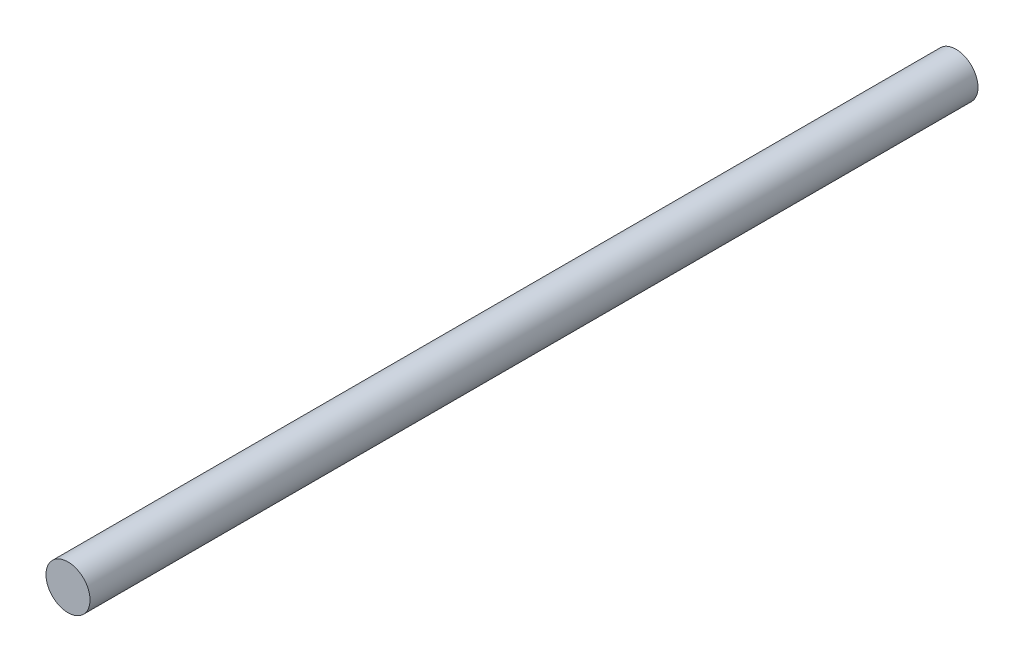
ISO-10303-21;
HEADER;
FILE_DESCRIPTION(('STEP AP214'),'2;1');
FILE_NAME('part.step','',(''),(''),'','','');
FILE_SCHEMA(('AUTOMOTIVE_DESIGN { 1 0 10303 214 1 1 1 1 }'));
ENDSEC;
DATA;
#1=APPLICATION_CONTEXT('core data for automotive mechanical design processes');
#2=APPLICATION_PROTOCOL_DEFINITION('international standard','automotive_design',2000,#1);
#3=PRODUCT_CONTEXT('',#1,'mechanical');
#4=PRODUCT('Part','Part','',(#3));
#5=PRODUCT_RELATED_PRODUCT_CATEGORY('part','',(#4));
#6=PRODUCT_DEFINITION_FORMATION('','',#4);
#7=PRODUCT_DEFINITION_CONTEXT('part definition',#1,'design');
#8=PRODUCT_DEFINITION('design','',#6,#7);
#9=PRODUCT_DEFINITION_SHAPE('','',#8);
#10=(LENGTH_UNIT() NAMED_UNIT(*) SI_UNIT(.MILLI.,.METRE.));
#11=(NAMED_UNIT(*) PLANE_ANGLE_UNIT() SI_UNIT($,.RADIAN.));
#12=(NAMED_UNIT(*) SI_UNIT($,.STERADIAN.) SOLID_ANGLE_UNIT());
#13=UNCERTAINTY_MEASURE_WITH_UNIT(LENGTH_MEASURE(1.E-05),#10,'distance_accuracy_value','');
#14=(GEOMETRIC_REPRESENTATION_CONTEXT(3) GLOBAL_UNCERTAINTY_ASSIGNED_CONTEXT((#13)) GLOBAL_UNIT_ASSIGNED_CONTEXT((#10,
#11,#12)) REPRESENTATION_CONTEXT('',''));
#15=CARTESIAN_POINT('',(0.,0.,0.));
#16=DIRECTION('',(0.,0.,1.));
#17=DIRECTION('',(1.,0.,0.));
#18=AXIS2_PLACEMENT_3D('',#15,#16,#17);
#19=CARTESIAN_POINT('',(0.,0.,80.));
#20=DIRECTION('',(0.,0.,-1.));
#21=DIRECTION('',(-1.,0.,0.));
#22=AXIS2_PLACEMENT_3D('',#19,#20,#21);
#23=CYLINDRICAL_SURFACE('',#22,1.985);
#24=CARTESIAN_POINT('',(0.,0.,80.));
#25=DIRECTION('',(0.,0.,1.));
#26=DIRECTION('',(1.,0.,0.));
#27=AXIS2_PLACEMENT_3D('',#24,#25,#26);
#28=CIRCLE('',#27,1.985);
#29=CARTESIAN_POINT('',(1.985,0.,80.));
#30=VERTEX_POINT('',#29);
#31=EDGE_CURVE('E10',#30,#30,#28,.T.);
#32=ORIENTED_EDGE('',*,*,#31,.F.);
#33=EDGE_LOOP('',(#32));
#34=FACE_BOUND('',#33,.T.);
#35=CARTESIAN_POINT('',(0.,0.,0.));
#36=DIRECTION('',(0.,0.,1.));
#37=DIRECTION('',(1.,0.,0.));
#38=AXIS2_PLACEMENT_3D('',#35,#36,#37);
#39=CIRCLE('',#38,1.985);
#40=CARTESIAN_POINT('',(1.985,0.,0.));
#41=VERTEX_POINT('',#40);
#42=EDGE_CURVE('E46',#41,#41,#39,.T.);
#43=ORIENTED_EDGE('',*,*,#42,.T.);
#44=EDGE_LOOP('',(#43));
#45=FACE_BOUND('',#44,.T.);
#46=ADVANCED_FACE('F43',(#34,#45),#23,.T.);
#47=CARTESIAN_POINT('',(0.,0.,80.));
#48=DIRECTION('',(0.,0.,1.));
#49=DIRECTION('',(1.,0.,0.));
#50=AXIS2_PLACEMENT_3D('',#47,#48,#49);
#51=PLANE('',#50);
#52=ORIENTED_EDGE('',*,*,#31,.T.);
#53=EDGE_LOOP('',(#52));
#54=FACE_BOUND('',#53,.T.);
#55=ADVANCED_FACE('F60',(#54),#51,.T.);
#56=CARTESIAN_POINT('',(0.,0.,0.));
#57=DIRECTION('',(0.,0.,1.));
#58=DIRECTION('',(1.,0.,0.));
#59=AXIS2_PLACEMENT_3D('',#56,#57,#58);
#60=PLANE('',#59);
#61=ORIENTED_EDGE('',*,*,#42,.F.);
#62=EDGE_LOOP('',(#61));
#63=FACE_BOUND('',#62,.T.);
#64=ADVANCED_FACE('F58',(#63),#60,.F.);
#65=CLOSED_SHELL('',(#46,#55,#64));
#66=MANIFOLD_SOLID_BREP('B2',#65);
#67=ADVANCED_BREP_SHAPE_REPRESENTATION('',(#18,#66),#14);
#68=SHAPE_DEFINITION_REPRESENTATION(#9,#67);
ENDSEC;
END-ISO-10303-21;
